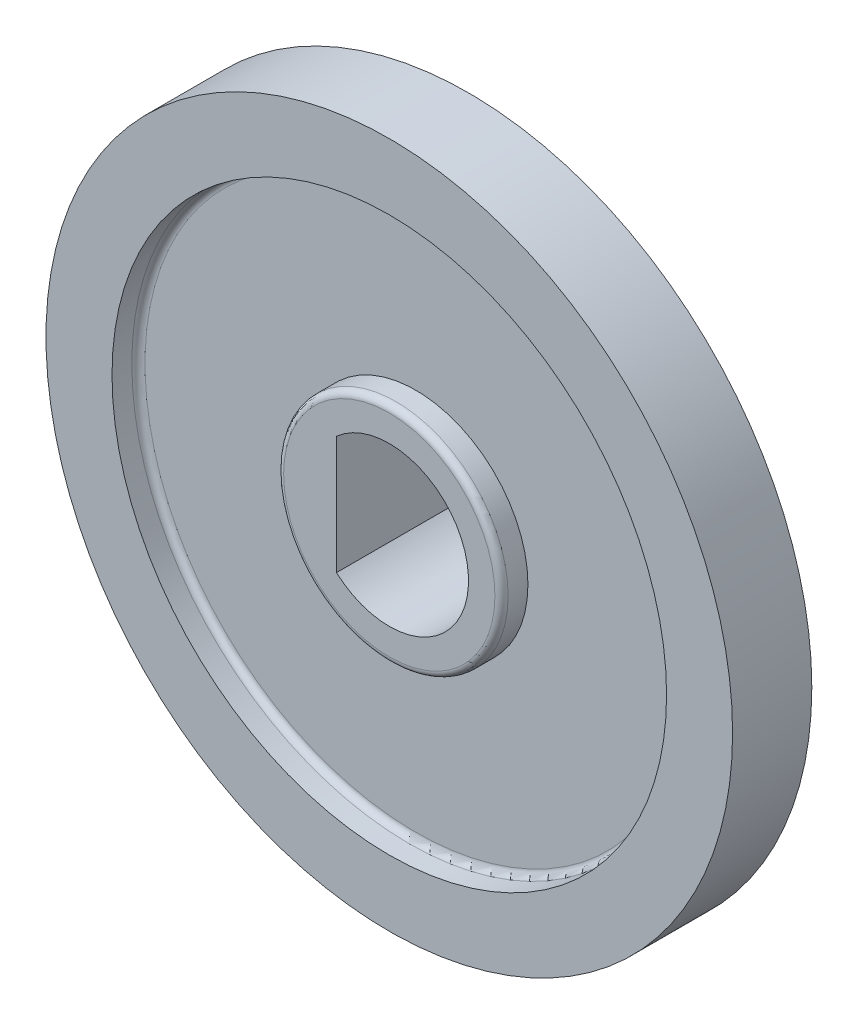
ISO-10303-21;
HEADER;
FILE_DESCRIPTION(('STEP AP214'),'2;1');
FILE_NAME('part.step','',(''),(''),'','','');
FILE_SCHEMA(('AUTOMOTIVE_DESIGN { 1 0 10303 214 1 1 1 1 }'));
ENDSEC;
DATA;
#1=APPLICATION_CONTEXT('core data for automotive mechanical design processes');
#2=APPLICATION_PROTOCOL_DEFINITION('international standard','automotive_design',2000,#1);
#3=PRODUCT_CONTEXT('',#1,'mechanical');
#4=PRODUCT('Part','Part','',(#3));
#5=PRODUCT_RELATED_PRODUCT_CATEGORY('part','',(#4));
#6=PRODUCT_DEFINITION_FORMATION('','',#4);
#7=PRODUCT_DEFINITION_CONTEXT('part definition',#1,'design');
#8=PRODUCT_DEFINITION('design','',#6,#7);
#9=PRODUCT_DEFINITION_SHAPE('','',#8);
#10=(LENGTH_UNIT() NAMED_UNIT(*) SI_UNIT(.MILLI.,.METRE.));
#11=(NAMED_UNIT(*) PLANE_ANGLE_UNIT() SI_UNIT($,.RADIAN.));
#12=(NAMED_UNIT(*) SI_UNIT($,.STERADIAN.) SOLID_ANGLE_UNIT());
#13=UNCERTAINTY_MEASURE_WITH_UNIT(LENGTH_MEASURE(1.E-05),#10,'distance_accuracy_value','');
#14=(GEOMETRIC_REPRESENTATION_CONTEXT(3) GLOBAL_UNCERTAINTY_ASSIGNED_CONTEXT((#13)) GLOBAL_UNIT_ASSIGNED_CONTEXT((#10,
#11,#12)) REPRESENTATION_CONTEXT('',''));
#15=CARTESIAN_POINT('',(0.,0.,0.));
#16=DIRECTION('',(0.,0.,1.));
#17=DIRECTION('',(1.,0.,0.));
#18=AXIS2_PLACEMENT_3D('',#15,#16,#17);
#19=CARTESIAN_POINT('',(12.4493620725286,0.168016430666877,0.));
#20=DIRECTION('',(0.,0.,-1.));
#21=DIRECTION('',(-1.,0.,0.));
#22=AXIS2_PLACEMENT_3D('',#19,#20,#21);
#23=PLANE('',#22);
#24=CARTESIAN_POINT('',(0.,1.80411241501588E-13,0.));
#25=DIRECTION('',(0.,0.,1.));
#26=DIRECTION('',(1.,0.,0.));
#27=AXIS2_PLACEMENT_3D('',#24,#25,#26);
#28=CIRCLE('',#27,13.);
#29=CARTESIAN_POINT('',(13.,1.80411241501588E-13,0.));
#30=VERTEX_POINT('',#29);
#31=EDGE_CURVE('E163',#30,#30,#28,.T.);
#32=ORIENTED_EDGE('',*,*,#31,.F.);
#33=EDGE_LOOP('',(#32));
#34=FACE_BOUND('',#33,.T.);
#35=CARTESIAN_POINT('',(1.83223184484201,7.80390816248508,0.));
#36=DIRECTION('',(0.,0.,-1.));
#37=DIRECTION('',(-1.,0.,0.));
#38=AXIS2_PLACEMENT_3D('',#35,#36,#37);
#39=CIRCLE('',#38,0.5);
#40=CARTESIAN_POINT('',(2.31519475798654,7.67449863993382,0.));
#41=VERTEX_POINT('',#40);
#42=CARTESIAN_POINT('',(1.71794752720512,7.31714426207516,0.));
#43=VERTEX_POINT('',#42);
#44=EDGE_CURVE('E211',#41,#43,#39,.T.);
#45=ORIENTED_EDGE('',*,*,#44,.F.);
#46=DIRECTION('',(-0.258819045102522,-0.96592582628907,0.));
#47=VECTOR('',#46,1.);
#48=CARTESIAN_POINT('',(1.11743469264317,3.20439722079534,0.));
#49=LINE('',#48,#47);
#50=CARTESIAN_POINT('',(2.69941085915804,9.10841265059187,0.));
#51=VERTEX_POINT('',#50);
#52=EDGE_CURVE('E228',#41,#51,#49,.F.);
#53=ORIENTED_EDGE('',*,*,#52,.T.);
#54=CARTESIAN_POINT('',(2.2164479460135,9.23782217314314,0.));
#55=DIRECTION('',(0.,0.,-1.));
#56=DIRECTION('',(-1.,0.,0.));
#57=AXIS2_PLACEMENT_3D('',#54,#55,#56);
#58=CIRCLE('',#57,0.5);
#59=CARTESIAN_POINT('',(2.33310310106685,9.72402334015066,0.));
#60=VERTEX_POINT('',#59);
#61=EDGE_CURVE('E226',#60,#51,#58,.T.);
#62=ORIENTED_EDGE('',*,*,#61,.F.);
#63=CARTESIAN_POINT('',(0.,0.,0.));
#64=DIRECTION('',(0.,0.,-1.));
#65=DIRECTION('',(-1.,0.,0.));
#66=AXIS2_PLACEMENT_3D('',#63,#64,#65);
#67=CIRCLE('',#66,10.0000000000001);
#68=CARTESIAN_POINT('',(-2.33310310106685,9.72402334015066,0.));
#69=VERTEX_POINT('',#68);
#70=EDGE_CURVE('E224',#60,#69,#67,.F.);
#71=ORIENTED_EDGE('',*,*,#70,.T.);
#72=CARTESIAN_POINT('',(-2.21644794601351,9.23782217314314,0.));
#73=DIRECTION('',(0.,0.,-1.));
#74=DIRECTION('',(-1.,0.,0.));
#75=AXIS2_PLACEMENT_3D('',#72,#73,#74);
#76=CIRCLE('',#75,0.5);
#77=CARTESIAN_POINT('',(-2.69941085915804,9.10841265059187,0.));
#78=VERTEX_POINT('',#77);
#79=EDGE_CURVE('E221',#78,#69,#76,.T.);
#80=ORIENTED_EDGE('',*,*,#79,.F.);
#81=DIRECTION('',(-0.258819045102522,0.96592582628907,0.));
#82=VECTOR('',#81,1.);
#83=CARTESIAN_POINT('',(0.550463564165188,-3.02028381546898,0.));
#84=LINE('',#83,#82);
#85=CARTESIAN_POINT('',(-2.31519475798654,7.67449863993382,0.));
#86=VERTEX_POINT('',#85);
#87=EDGE_CURVE('E219',#78,#86,#84,.F.);
#88=ORIENTED_EDGE('',*,*,#87,.T.);
#89=CARTESIAN_POINT('',(-1.83223184484201,7.80390816248508,0.));
#90=DIRECTION('',(0.,0.,-1.));
#91=DIRECTION('',(-1.,0.,0.));
#92=AXIS2_PLACEMENT_3D('',#89,#90,#91);
#93=CIRCLE('',#92,0.5);
#94=CARTESIAN_POINT('',(-1.71794752720512,7.31714426207517,0.));
#95=VERTEX_POINT('',#94);
#96=EDGE_CURVE('E216',#95,#86,#93,.T.);
#97=ORIENTED_EDGE('',*,*,#96,.F.);
#98=CARTESIAN_POINT('',(0.,0.,0.));
#99=DIRECTION('',(0.,0.,-1.));
#100=DIRECTION('',(-1.,0.,0.));
#101=AXIS2_PLACEMENT_3D('',#98,#99,#100);
#102=CIRCLE('',#101,7.51611228350465);
#103=EDGE_CURVE('E214',#95,#43,#102,.T.);
#104=ORIENTED_EDGE('',*,*,#103,.T.);
#105=EDGE_LOOP('',(#45,#53,#62,#71,#80,#88,#97,#104));
#106=FACE_BOUND('',#105,.T.);
#107=CARTESIAN_POINT('',(0.,1.80411241501588E-13,0.));
#108=DIRECTION('',(0.,0.,-1.));
#109=DIRECTION('',(-1.,0.,0.));
#110=AXIS2_PLACEMENT_3D('',#107,#108,#109);
#111=CIRCLE('',#110,4.24999999999994);
#112=CARTESIAN_POINT('',(-4.24999999999996,1.80411241501588E-13,0.));
#113=VERTEX_POINT('',#112);
#114=EDGE_CURVE('E169',#113,#113,#111,.T.);
#115=ORIENTED_EDGE('',*,*,#114,.F.);
#116=EDGE_LOOP('',(#115));
#117=FACE_BOUND('',#116,.T.);
#118=ADVANCED_FACE('F37',(#34,#106,#117),#23,.T.);
#119=CARTESIAN_POINT('',(12.4493620725286,0.168016430666877,3.));
#120=DIRECTION('',(0.,0.,-1.));
#121=DIRECTION('',(-1.,0.,0.));
#122=AXIS2_PLACEMENT_3D('',#119,#120,#121);
#123=PLANE('',#122);
#124=CARTESIAN_POINT('',(0.,0.,3.));
#125=DIRECTION('',(0.,0.,-1.));
#126=DIRECTION('',(-1.,0.,0.));
#127=AXIS2_PLACEMENT_3D('',#124,#125,#126);
#128=CIRCLE('',#127,4.);
#129=CARTESIAN_POINT('',(-4.00000000000001,0.,3.));
#130=VERTEX_POINT('',#129);
#131=EDGE_CURVE('E46',#130,#130,#128,.F.);
#132=ORIENTED_EDGE('',*,*,#131,.T.);
#133=EDGE_LOOP('',(#132));
#134=FACE_BOUND('',#133,.T.);
#135=CARTESIAN_POINT('',(0.,1.80411241501588E-13,3.));
#136=DIRECTION('',(0.,0.,1.));
#137=DIRECTION('',(1.,0.,0.));
#138=AXIS2_PLACEMENT_3D('',#135,#136,#137);
#139=CIRCLE('',#138,3.);
#140=CARTESIAN_POINT('',(-2.00000000000001,-2.23606797749962,3.));
#141=VERTEX_POINT('',#140);
#142=CARTESIAN_POINT('',(-2.00000000000002,2.23606797749996,3.));
#143=VERTEX_POINT('',#142);
#144=EDGE_CURVE('E160',#141,#143,#139,.T.);
#145=ORIENTED_EDGE('',*,*,#144,.F.);
#146=DIRECTION('',(0.,-1.,0.));
#147=VECTOR('',#146,1.);
#148=CARTESIAN_POINT('',(-2.00000000000002,2.23606797749996,3.));
#149=LINE('',#148,#147);
#150=EDGE_CURVE('E185',#143,#141,#149,.T.);
#151=ORIENTED_EDGE('',*,*,#150,.F.);
#152=EDGE_LOOP('',(#145,#151));
#153=FACE_BOUND('',#152,.T.);
#154=ADVANCED_FACE('F392',(#134,#153),#123,.F.);
#155=CARTESIAN_POINT('',(0.,1.80411241501588E-13,3.));
#156=DIRECTION('',(0.,0.,1.));
#157=DIRECTION('',(1.,0.,0.));
#158=AXIS2_PLACEMENT_3D('',#155,#156,#157);
#159=CIRCLE('',#158,13.);
#160=CARTESIAN_POINT('',(13.,1.80411241501588E-13,3.));
#161=VERTEX_POINT('',#160);
#162=EDGE_CURVE('E188',#161,#161,#159,.T.);
#163=ORIENTED_EDGE('',*,*,#162,.T.);
#164=EDGE_LOOP('',(#163));
#165=FACE_BOUND('',#164,.T.);
#166=CARTESIAN_POINT('',(0.,0.,3.));
#167=DIRECTION('',(0.,0.,1.));
#168=DIRECTION('',(1.,0.,0.));
#169=AXIS2_PLACEMENT_3D('',#166,#167,#168);
#170=CIRCLE('',#169,10.5);
#171=CARTESIAN_POINT('',(10.5,0.,3.));
#172=VERTEX_POINT('',#171);
#173=EDGE_CURVE('E181',#172,#172,#170,.T.);
#174=ORIENTED_EDGE('',*,*,#173,.F.);
#175=EDGE_LOOP('',(#174));
#176=FACE_BOUND('',#175,.T.);
#177=ADVANCED_FACE('F398',(#165,#176),#123,.F.);
#178=CARTESIAN_POINT('',(0.,1.80411241501588E-13,3.));
#179=DIRECTION('',(0.,0.,-1.));
#180=DIRECTION('',(-1.,0.,0.));
#181=AXIS2_PLACEMENT_3D('',#178,#179,#180);
#182=CYLINDRICAL_SURFACE('',#181,13.);
#183=ORIENTED_EDGE('',*,*,#31,.T.);
#184=EDGE_LOOP('',(#183));
#185=FACE_BOUND('',#184,.T.);
#186=ORIENTED_EDGE('',*,*,#162,.F.);
#187=EDGE_LOOP('',(#186));
#188=FACE_BOUND('',#187,.T.);
#189=ADVANCED_FACE('F405',(#185,#188),#182,.T.);
#190=CARTESIAN_POINT('',(0.,1.80411241501588E-13,3.));
#191=DIRECTION('',(0.,0.,-1.));
#192=DIRECTION('',(-1.,0.,0.));
#193=AXIS2_PLACEMENT_3D('',#190,#191,#192);
#194=CYLINDRICAL_SURFACE('',#193,3.);
#195=DIRECTION('',(0.,0.,-1.));
#196=VECTOR('',#195,1.);
#197=CARTESIAN_POINT('',(-2.00000000000002,2.23606797749996,3.));
#198=LINE('',#197,#196);
#199=CARTESIAN_POINT('',(-2.00000000000002,2.23606797749996,-3.3));
#200=VERTEX_POINT('',#199);
#201=EDGE_CURVE('E152',#143,#200,#198,.T.);
#202=ORIENTED_EDGE('',*,*,#201,.T.);
#203=CARTESIAN_POINT('',(0.,1.73472347597681E-13,-3.3));
#204=DIRECTION('',(0.,0.,-1.));
#205=DIRECTION('',(-1.,0.,0.));
#206=AXIS2_PLACEMENT_3D('',#203,#204,#205);
#207=CIRCLE('',#206,3.);
#208=CARTESIAN_POINT('',(-2.00000000000002,-2.23606797749962,-3.3));
#209=VERTEX_POINT('',#208);
#210=EDGE_CURVE('E157',#200,#209,#207,.T.);
#211=ORIENTED_EDGE('',*,*,#210,.T.);
#212=DIRECTION('',(0.,0.,-1.));
#213=VECTOR('',#212,1.);
#214=CARTESIAN_POINT('',(-2.00000000000001,-2.23606797749962,3.));
#215=LINE('',#214,#213);
#216=EDGE_CURVE('E164',#141,#209,#215,.T.);
#217=ORIENTED_EDGE('',*,*,#216,.F.);
#218=ORIENTED_EDGE('',*,*,#144,.T.);
#219=EDGE_LOOP('',(#202,#211,#217,#218));
#220=FACE_BOUND('',#219,.T.);
#221=ADVANCED_FACE('F154',(#220),#194,.F.);
#222=CARTESIAN_POINT('',(-2.00000000000002,2.23606797749996,3.));
#223=DIRECTION('',(1.,0.,0.));
#224=DIRECTION('',(0.,1.,0.));
#225=AXIS2_PLACEMENT_3D('',#222,#223,#224);
#226=PLANE('',#225);
#227=ORIENTED_EDGE('',*,*,#216,.T.);
#228=DIRECTION('',(0.,1.,0.));
#229=VECTOR('',#228,1.);
#230=CARTESIAN_POINT('',(-2.00000000000002,2.23606797749996,-3.3));
#231=LINE('',#230,#229);
#232=EDGE_CURVE('E166',#209,#200,#231,.T.);
#233=ORIENTED_EDGE('',*,*,#232,.T.);
#234=ORIENTED_EDGE('',*,*,#201,.F.);
#235=ORIENTED_EDGE('',*,*,#150,.T.);
#236=EDGE_LOOP('',(#227,#233,#234,#235));
#237=FACE_BOUND('',#236,.T.);
#238=ADVANCED_FACE('F167',(#237),#226,.T.);
#239=CARTESIAN_POINT('',(0.,0.,2.));
#240=DIRECTION('',(0.,0.,1.));
#241=DIRECTION('',(1.,0.,0.));
#242=AXIS2_PLACEMENT_3D('',#239,#240,#241);
#243=CYLINDRICAL_SURFACE('',#242,10.5);
#244=CARTESIAN_POINT('',(0.,0.,2.25));
#245=DIRECTION('',(0.,0.,1.));
#246=DIRECTION('',(1.,0.,0.));
#247=AXIS2_PLACEMENT_3D('',#244,#245,#246);
#248=CIRCLE('',#247,10.5);
#249=CARTESIAN_POINT('',(10.5,0.,2.25));
#250=VERTEX_POINT('',#249);
#251=EDGE_CURVE('E258',#250,#250,#248,.F.);
#252=ORIENTED_EDGE('',*,*,#251,.T.);
#253=EDGE_LOOP('',(#252));
#254=FACE_BOUND('',#253,.T.);
#255=ORIENTED_EDGE('',*,*,#173,.T.);
#256=EDGE_LOOP('',(#255));
#257=FACE_BOUND('',#256,.T.);
#258=ADVANCED_FACE('F499',(#254,#257),#243,.F.);
#259=CARTESIAN_POINT('',(0.,0.,2.));
#260=DIRECTION('',(0.,0.,1.));
#261=DIRECTION('',(1.,0.,0.));
#262=AXIS2_PLACEMENT_3D('',#259,#260,#261);
#263=PLANE('',#262);
#264=CARTESIAN_POINT('',(0.,0.,2.));
#265=DIRECTION('',(0.,0.,1.));
#266=DIRECTION('',(1.,0.,0.));
#267=AXIS2_PLACEMENT_3D('',#264,#265,#266);
#268=CIRCLE('',#267,10.25);
#269=CARTESIAN_POINT('',(10.25,0.,2.));
#270=VERTEX_POINT('',#269);
#271=EDGE_CURVE('E255',#270,#270,#268,.T.);
#272=ORIENTED_EDGE('',*,*,#271,.T.);
#273=EDGE_LOOP('',(#272));
#274=FACE_BOUND('',#273,.T.);
#275=CARTESIAN_POINT('',(0.,0.,2.));
#276=DIRECTION('',(0.,0.,1.));
#277=DIRECTION('',(1.,0.,0.));
#278=AXIS2_PLACEMENT_3D('',#275,#276,#277);
#279=CIRCLE('',#278,4.25);
#280=CARTESIAN_POINT('',(4.25000000000001,0.,2.));
#281=VERTEX_POINT('',#280);
#282=EDGE_CURVE('E178',#281,#281,#279,.T.);
#283=ORIENTED_EDGE('',*,*,#282,.F.);
#284=EDGE_LOOP('',(#283));
#285=FACE_BOUND('',#284,.T.);
#286=ADVANCED_FACE('F492',(#274,#285),#263,.T.);
#287=CARTESIAN_POINT('',(0.,0.,2.));
#288=DIRECTION('',(0.,0.,1.));
#289=DIRECTION('',(1.,0.,0.));
#290=AXIS2_PLACEMENT_3D('',#287,#288,#289);
#291=CYLINDRICAL_SURFACE('',#290,4.25);
#292=CARTESIAN_POINT('',(0.,0.,2.75));
#293=DIRECTION('',(0.,0.,-1.));
#294=DIRECTION('',(-1.,0.,0.));
#295=AXIS2_PLACEMENT_3D('',#292,#293,#294);
#296=CIRCLE('',#295,4.25);
#297=CARTESIAN_POINT('',(-4.25000000000001,0.,2.75));
#298=VERTEX_POINT('',#297);
#299=EDGE_CURVE('E11',#298,#298,#296,.T.);
#300=ORIENTED_EDGE('',*,*,#299,.T.);
#301=EDGE_LOOP('',(#300));
#302=FACE_BOUND('',#301,.T.);
#303=ORIENTED_EDGE('',*,*,#282,.T.);
#304=EDGE_LOOP('',(#303));
#305=FACE_BOUND('',#304,.T.);
#306=ADVANCED_FACE('F484',(#302,#305),#291,.T.);
#307=CARTESIAN_POINT('',(0.,1.73472347597681E-13,-3.3));
#308=DIRECTION('',(0.,0.,-1.));
#309=DIRECTION('',(-1.,0.,0.));
#310=AXIS2_PLACEMENT_3D('',#307,#308,#309);
#311=PLANE('',#310);
#312=CARTESIAN_POINT('',(0.,1.73472347597681E-13,-3.3));
#313=DIRECTION('',(0.,0.,-1.));
#314=DIRECTION('',(-1.,0.,0.));
#315=AXIS2_PLACEMENT_3D('',#312,#313,#314);
#316=CIRCLE('',#315,3.99999999999994);
#317=CARTESIAN_POINT('',(-3.99999999999996,1.73472347597681E-13,-3.3));
#318=VERTEX_POINT('',#317);
#319=EDGE_CURVE('E261',#318,#318,#316,.T.);
#320=ORIENTED_EDGE('',*,*,#319,.T.);
#321=EDGE_LOOP('',(#320));
#322=FACE_BOUND('',#321,.T.);
#323=ORIENTED_EDGE('',*,*,#232,.F.);
#324=ORIENTED_EDGE('',*,*,#210,.F.);
#325=EDGE_LOOP('',(#323,#324));
#326=FACE_BOUND('',#325,.T.);
#327=ADVANCED_FACE('F171',(#322,#326),#311,.T.);
#328=CARTESIAN_POINT('',(0.,1.73472347597681E-13,-3.3));
#329=DIRECTION('',(0.,0.,1.));
#330=DIRECTION('',(1.,0.,0.));
#331=AXIS2_PLACEMENT_3D('',#328,#329,#330);
#332=CYLINDRICAL_SURFACE('',#331,4.24999999999994);
#333=CARTESIAN_POINT('',(0.,1.73472347597681E-13,-3.05));
#334=DIRECTION('',(0.,0.,-1.));
#335=DIRECTION('',(-1.,0.,0.));
#336=AXIS2_PLACEMENT_3D('',#333,#334,#335);
#337=CIRCLE('',#336,4.24999999999994);
#338=CARTESIAN_POINT('',(-4.24999999999996,1.73472347597681E-13,-3.05));
#339=VERTEX_POINT('',#338);
#340=EDGE_CURVE('E264',#339,#339,#337,.F.);
#341=ORIENTED_EDGE('',*,*,#340,.T.);
#342=EDGE_LOOP('',(#341));
#343=FACE_BOUND('',#342,.T.);
#344=ORIENTED_EDGE('',*,*,#114,.T.);
#345=EDGE_LOOP('',(#344));
#346=FACE_BOUND('',#345,.T.);
#347=ADVANCED_FACE('F483',(#343,#346),#332,.T.);
#348=CARTESIAN_POINT('',(0.,0.,-1.75));
#349=DIRECTION('',(0.,0.,1.));
#350=DIRECTION('',(1.,0.,0.));
#351=AXIS2_PLACEMENT_3D('',#348,#349,#350);
#352=CYLINDRICAL_SURFACE('',#351,9.75000000000012);
#353=DIRECTION('',(0.,0.,1.));
#354=VECTOR('',#353,1.);
#355=CARTESIAN_POINT('',(2.27477552354017,9.4809227566469,-1.75));
#356=LINE('',#355,#354);
#357=CARTESIAN_POINT('',(2.27477552354017,9.4809227566469,-0.25));
#358=VERTEX_POINT('',#357);
#359=CARTESIAN_POINT('',(2.27477552354017,9.4809227566469,-1.5));
#360=VERTEX_POINT('',#359);
#361=EDGE_CURVE('E235',#358,#360,#356,.F.);
#362=ORIENTED_EDGE('',*,*,#361,.T.);
#363=CARTESIAN_POINT('',(0.,0.,-1.5));
#364=DIRECTION('',(0.,0.,-1.));
#365=DIRECTION('',(-1.,0.,0.));
#366=AXIS2_PLACEMENT_3D('',#363,#364,#365);
#367=CIRCLE('',#366,9.75000000000012);
#368=CARTESIAN_POINT('',(-2.27477552354018,9.4809227566469,-1.5));
#369=VERTEX_POINT('',#368);
#370=EDGE_CURVE('E237',#360,#369,#367,.F.);
#371=ORIENTED_EDGE('',*,*,#370,.T.);
#372=DIRECTION('',(0.,0.,1.));
#373=VECTOR('',#372,1.);
#374=CARTESIAN_POINT('',(-2.27477552354018,9.4809227566469,-1.75));
#375=LINE('',#374,#373);
#376=CARTESIAN_POINT('',(-2.27477552354018,9.4809227566469,-0.25));
#377=VERTEX_POINT('',#376);
#378=EDGE_CURVE('E231',#369,#377,#375,.T.);
#379=ORIENTED_EDGE('',*,*,#378,.T.);
#380=CARTESIAN_POINT('',(0.,0.,-0.25));
#381=DIRECTION('',(0.,0.,-1.));
#382=DIRECTION('',(-1.,0.,0.));
#383=AXIS2_PLACEMENT_3D('',#380,#381,#382);
#384=CIRCLE('',#383,9.75000000000012);
#385=EDGE_CURVE('E233',#377,#358,#384,.T.);
#386=ORIENTED_EDGE('',*,*,#385,.T.);
#387=EDGE_LOOP('',(#362,#371,#379,#386));
#388=FACE_BOUND('',#387,.T.);
#389=ADVANCED_FACE('F389',(#388),#352,.T.);
#390=CARTESIAN_POINT('',(2.01001776537564,7.50148842449792,-1.75));
#391=DIRECTION('',(-0.96592582628907,0.258819045102522,0.));
#392=DIRECTION('',(-0.258819045102522,-0.96592582628907,0.));
#393=AXIS2_PLACEMENT_3D('',#390,#391,#392);
#394=PLANE('',#393);
#395=DIRECTION('',(-0.258819045102522,-0.96592582628907,0.));
#396=VECTOR('',#395,1.);
#397=CARTESIAN_POINT('',(2.52348568974961,9.41777680631854,-1.5));
#398=LINE('',#397,#396);
#399=CARTESIAN_POINT('',(2.07371330141427,7.73920340120945,-1.5));
#400=VERTEX_POINT('',#399);
#401=CARTESIAN_POINT('',(2.45792940258577,9.17311741186751,-1.5));
#402=VERTEX_POINT('',#401);
#403=EDGE_CURVE('E206',#400,#402,#398,.F.);
#404=ORIENTED_EDGE('',*,*,#403,.T.);
#405=DIRECTION('',(0.,0.,1.));
#406=VECTOR('',#405,1.);
#407=CARTESIAN_POINT('',(2.45792940258577,9.17311741186751,-1.75));
#408=LINE('',#407,#406);
#409=CARTESIAN_POINT('',(2.45792940258577,9.17311741186751,-0.25));
#410=VERTEX_POINT('',#409);
#411=EDGE_CURVE('E209',#402,#410,#408,.T.);
#412=ORIENTED_EDGE('',*,*,#411,.T.);
#413=DIRECTION('',(-0.258819045102522,-0.96592582628907,0.));
#414=VECTOR('',#413,1.);
#415=CARTESIAN_POINT('',(2.01001776537564,7.50148842449792,-0.25));
#416=LINE('',#415,#414);
#417=CARTESIAN_POINT('',(2.07371330141427,7.73920340120945,-0.25));
#418=VERTEX_POINT('',#417);
#419=EDGE_CURVE('E204',#410,#418,#416,.T.);
#420=ORIENTED_EDGE('',*,*,#419,.T.);
#421=DIRECTION('',(0.,0.,1.));
#422=VECTOR('',#421,1.);
#423=CARTESIAN_POINT('',(2.07371330141427,7.73920340120945,-1.75));
#424=LINE('',#423,#422);
#425=EDGE_CURVE('E202',#418,#400,#424,.F.);
#426=ORIENTED_EDGE('',*,*,#425,.T.);
#427=EDGE_LOOP('',(#404,#412,#420,#426));
#428=FACE_BOUND('',#427,.T.);
#429=ADVANCED_FACE('F362',(#428),#394,.F.);
#430=CARTESIAN_POINT('',(0.,0.,-1.75));
#431=DIRECTION('',(0.,0.,1.));
#432=DIRECTION('',(1.,0.,0.));
#433=AXIS2_PLACEMENT_3D('',#430,#431,#432);
#434=CYLINDRICAL_SURFACE('',#433,7.76611228350465);
#435=CARTESIAN_POINT('',(0.,0.,-1.5));
#436=DIRECTION('',(0.,0.,-1.));
#437=DIRECTION('',(-1.,0.,0.));
#438=AXIS2_PLACEMENT_3D('',#435,#436,#437);
#439=CIRCLE('',#438,7.76611228350465);
#440=CARTESIAN_POINT('',(-1.77508968602357,7.56052621228012,-1.5));
#441=VERTEX_POINT('',#440);
#442=CARTESIAN_POINT('',(1.77508968602356,7.56052621228012,-1.5));
#443=VERTEX_POINT('',#442);
#444=EDGE_CURVE('E54',#441,#443,#439,.T.);
#445=ORIENTED_EDGE('',*,*,#444,.T.);
#446=DIRECTION('',(0.,0.,1.));
#447=VECTOR('',#446,1.);
#448=CARTESIAN_POINT('',(1.77508968602356,7.56052621228012,-1.75));
#449=LINE('',#448,#447);
#450=CARTESIAN_POINT('',(1.77508968602356,7.56052621228012,-0.25));
#451=VERTEX_POINT('',#450);
#452=EDGE_CURVE('E253',#443,#451,#449,.T.);
#453=ORIENTED_EDGE('',*,*,#452,.T.);
#454=CARTESIAN_POINT('',(0.,0.,-0.25));
#455=DIRECTION('',(0.,0.,-1.));
#456=DIRECTION('',(-1.,0.,0.));
#457=AXIS2_PLACEMENT_3D('',#454,#455,#456);
#458=CIRCLE('',#457,7.76611228350465);
#459=CARTESIAN_POINT('',(-1.77508968602357,7.56052621228012,-0.25));
#460=VERTEX_POINT('',#459);
#461=EDGE_CURVE('E249',#451,#460,#458,.F.);
#462=ORIENTED_EDGE('',*,*,#461,.T.);
#463=DIRECTION('',(0.,0.,1.));
#464=VECTOR('',#463,1.);
#465=CARTESIAN_POINT('',(-1.77508968602357,7.56052621228013,-1.75));
#466=LINE('',#465,#464);
#467=EDGE_CURVE('E59',#460,#441,#466,.F.);
#468=ORIENTED_EDGE('',*,*,#467,.T.);
#469=EDGE_LOOP('',(#445,#453,#462,#468));
#470=FACE_BOUND('',#469,.T.);
#471=ADVANCED_FACE('F378',(#470),#434,.F.);
#472=CARTESIAN_POINT('',(-2.01001776537564,7.50148842449793,-1.75));
#473=DIRECTION('',(0.96592582628907,0.258819045102522,0.));
#474=DIRECTION('',(-0.258819045102522,0.96592582628907,0.));
#475=AXIS2_PLACEMENT_3D('',#472,#473,#474);
#476=PLANE('',#475);
#477=DIRECTION('',(0.,0.,1.));
#478=VECTOR('',#477,1.);
#479=CARTESIAN_POINT('',(-2.45792940258578,9.17311741186751,-1.75));
#480=LINE('',#479,#478);
#481=CARTESIAN_POINT('',(-2.45792940258578,9.17311741186751,-0.25));
#482=VERTEX_POINT('',#481);
#483=CARTESIAN_POINT('',(-2.45792940258578,9.17311741186751,-1.5));
#484=VERTEX_POINT('',#483);
#485=EDGE_CURVE('E244',#482,#484,#480,.F.);
#486=ORIENTED_EDGE('',*,*,#485,.T.);
#487=DIRECTION('',(-0.258819045102522,0.96592582628907,0.));
#488=VECTOR('',#487,1.);
#489=CARTESIAN_POINT('',(-2.01001776537564,7.50148842449793,-1.5));
#490=LINE('',#489,#488);
#491=CARTESIAN_POINT('',(-2.07371330141428,7.73920340120945,-1.5));
#492=VERTEX_POINT('',#491);
#493=EDGE_CURVE('E246',#484,#492,#490,.F.);
#494=ORIENTED_EDGE('',*,*,#493,.T.);
#495=DIRECTION('',(0.,0.,1.));
#496=VECTOR('',#495,1.);
#497=CARTESIAN_POINT('',(-2.07371330141428,7.73920340120945,-1.75));
#498=LINE('',#497,#496);
#499=CARTESIAN_POINT('',(-2.07371330141428,7.73920340120945,-0.25));
#500=VERTEX_POINT('',#499);
#501=EDGE_CURVE('E240',#492,#500,#498,.T.);
#502=ORIENTED_EDGE('',*,*,#501,.T.);
#503=DIRECTION('',(-0.258819045102522,0.96592582628907,0.));
#504=VECTOR('',#503,1.);
#505=CARTESIAN_POINT('',(-2.01001776537564,7.50148842449793,-0.25));
#506=LINE('',#505,#504);
#507=EDGE_CURVE('E242',#500,#482,#506,.T.);
#508=ORIENTED_EDGE('',*,*,#507,.T.);
#509=EDGE_LOOP('',(#486,#494,#502,#508));
#510=FACE_BOUND('',#509,.T.);
#511=ADVANCED_FACE('F380',(#510),#476,.F.);
#512=CARTESIAN_POINT('',(0.,0.,-1.75));
#513=DIRECTION('',(0.,0.,-1.));
#514=DIRECTION('',(-1.,0.,0.));
#515=AXIS2_PLACEMENT_3D('',#512,#513,#514);
#516=PLANE('',#515);
#517=CARTESIAN_POINT('',(0.,0.,-1.75));
#518=DIRECTION('',(0.,0.,-1.));
#519=DIRECTION('',(-1.,0.,0.));
#520=AXIS2_PLACEMENT_3D('',#517,#518,#519);
#521=CIRCLE('',#520,9.50000000000012);
#522=CARTESIAN_POINT('',(-2.21644794601351,9.23782217314314,-1.75));
#523=VERTEX_POINT('',#522);
#524=CARTESIAN_POINT('',(2.2164479460135,9.23782217314314,-1.75));
#525=VERTEX_POINT('',#524);
#526=EDGE_CURVE('E197',#523,#525,#521,.T.);
#527=ORIENTED_EDGE('',*,*,#526,.T.);
#528=DIRECTION('',(-0.258819045102522,-0.96592582628907,0.));
#529=VECTOR('',#528,1.);
#530=CARTESIAN_POINT('',(1.76853630880337,7.56619318577355,-1.75));
#531=LINE('',#530,#529);
#532=CARTESIAN_POINT('',(1.83223184484201,7.80390816248507,-1.75));
#533=VERTEX_POINT('',#532);
#534=EDGE_CURVE('E199',#525,#533,#531,.T.);
#535=ORIENTED_EDGE('',*,*,#534,.T.);
#536=CARTESIAN_POINT('',(0.,0.,-1.75));
#537=DIRECTION('',(0.,0.,-1.));
#538=DIRECTION('',(-1.,0.,0.));
#539=AXIS2_PLACEMENT_3D('',#536,#537,#538);
#540=CIRCLE('',#539,8.01611228350465);
#541=CARTESIAN_POINT('',(-1.83223184484201,7.80390816248508,-1.75));
#542=VERTEX_POINT('',#541);
#543=EDGE_CURVE('E191',#533,#542,#540,.F.);
#544=ORIENTED_EDGE('',*,*,#543,.T.);
#545=DIRECTION('',(-0.258819045102522,0.96592582628907,0.));
#546=VECTOR('',#545,1.);
#547=CARTESIAN_POINT('',(-2.28200423317735,9.48248156759417,-1.75));
#548=LINE('',#547,#546);
#549=EDGE_CURVE('E195',#542,#523,#548,.T.);
#550=ORIENTED_EDGE('',*,*,#549,.T.);
#551=EDGE_LOOP('',(#527,#535,#544,#550));
#552=FACE_BOUND('',#551,.T.);
#553=ADVANCED_FACE('F386',(#552),#516,.T.);
#554=CARTESIAN_POINT('',(-2.25149922194791,7.43678366322229,-0.25));
#555=DIRECTION('',(-0.258819045102522,0.96592582628907,0.));
#556=DIRECTION('',(-0.96592582628907,-0.258819045102522,0.));
#557=AXIS2_PLACEMENT_3D('',#554,#555,#556);
#558=CYLINDRICAL_SURFACE('',#557,0.25);
#559=CARTESIAN_POINT('',(-2.31519475798654,7.67449863993382,-0.25));
#560=DIRECTION('',(-0.258819045102524,0.96592582628907,0.));
#561=DIRECTION('',(-0.96592582628907,-0.258819045102524,0.));
#562=AXIS2_PLACEMENT_3D('',#559,#560,#561);
#563=CIRCLE('',#562,0.25);
#564=EDGE_CURVE('E174',#86,#500,#563,.T.);
#565=ORIENTED_EDGE('',*,*,#564,.F.);
#566=ORIENTED_EDGE('',*,*,#87,.F.);
#567=CARTESIAN_POINT('',(-2.69941085915804,9.10841265059187,-0.25));
#568=DIRECTION('',(0.25881904510252,-0.965925826289071,0.));
#569=DIRECTION('',(0.965925826289071,0.25881904510252,0.));
#570=AXIS2_PLACEMENT_3D('',#567,#568,#569);
#571=CIRCLE('',#570,0.25);
#572=EDGE_CURVE('E41',#482,#78,#571,.T.);
#573=ORIENTED_EDGE('',*,*,#572,.F.);
#574=ORIENTED_EDGE('',*,*,#507,.F.);
#575=EDGE_LOOP('',(#565,#566,#573,#574));
#576=FACE_BOUND('',#575,.T.);
#577=ADVANCED_FACE('F465',(#576),#558,.F.);
#578=CARTESIAN_POINT('',(-2.21644794601351,9.23782217314314,-0.25));
#579=DIRECTION('',(0.,0.,-1.));
#580=DIRECTION('',(-1.,0.,0.));
#581=AXIS2_PLACEMENT_3D('',#578,#579,#580);
#582=TOROIDAL_SURFACE('',#581,0.5,0.25);
#583=ORIENTED_EDGE('',*,*,#572,.T.);
#584=ORIENTED_EDGE('',*,*,#79,.T.);
#585=CARTESIAN_POINT('',(-2.33310310106685,9.72402334015066,-0.25));
#586=DIRECTION('',(0.972402334015056,0.233310310106682,0.));
#587=DIRECTION('',(-0.233310310106682,0.972402334015056,0.));
#588=AXIS2_PLACEMENT_3D('',#585,#586,#587);
#589=CIRCLE('',#588,0.25);
#590=EDGE_CURVE('E327',#377,#69,#589,.F.);
#591=ORIENTED_EDGE('',*,*,#590,.F.);
#592=CARTESIAN_POINT('',(-2.21644794601351,9.23782217314314,-0.25));
#593=DIRECTION('',(0.,0.,-1.));
#594=DIRECTION('',(-1.,0.,0.));
#595=AXIS2_PLACEMENT_3D('',#592,#593,#594);
#596=CIRCLE('',#595,0.25);
#597=EDGE_CURVE('E324',#482,#377,#596,.T.);
#598=ORIENTED_EDGE('',*,*,#597,.F.);
#599=EDGE_LOOP('',(#583,#584,#591,#598));
#600=FACE_BOUND('',#599,.T.);
#601=ADVANCED_FACE('F462',(#600),#582,.F.);
#602=CARTESIAN_POINT('',(-1.83223184484201,7.80390816248508,-0.25));
#603=DIRECTION('',(0.,0.,-1.));
#604=DIRECTION('',(-1.,0.,0.));
#605=AXIS2_PLACEMENT_3D('',#602,#603,#604);
#606=TOROIDAL_SURFACE('',#605,0.5,0.25);
#607=ORIENTED_EDGE('',*,*,#96,.T.);
#608=ORIENTED_EDGE('',*,*,#564,.T.);
#609=CARTESIAN_POINT('',(-1.83223184484201,7.80390816248508,-0.25));
#610=DIRECTION('',(0.,0.,-1.));
#611=DIRECTION('',(-1.,0.,0.));
#612=AXIS2_PLACEMENT_3D('',#609,#610,#611);
#613=CIRCLE('',#612,0.25);
#614=EDGE_CURVE('E321',#460,#500,#613,.T.);
#615=ORIENTED_EDGE('',*,*,#614,.F.);
#616=CARTESIAN_POINT('',(-1.71794752720512,7.31714426207517,-0.25));
#617=DIRECTION('',(0.973527800819827,0.228568635273776,0.));
#618=DIRECTION('',(-0.228568635273776,0.973527800819827,0.));
#619=AXIS2_PLACEMENT_3D('',#616,#617,#618);
#620=CIRCLE('',#619,0.25);
#621=EDGE_CURVE('E318',#95,#460,#620,.F.);
#622=ORIENTED_EDGE('',*,*,#621,.F.);
#623=EDGE_LOOP('',(#607,#608,#615,#622));
#624=FACE_BOUND('',#623,.T.);
#625=ADVANCED_FACE('F333',(#624),#606,.F.);
#626=CARTESIAN_POINT('',(0.,0.,-0.25));
#627=DIRECTION('',(0.,0.,-1.));
#628=DIRECTION('',(-1.,0.,0.));
#629=AXIS2_PLACEMENT_3D('',#626,#627,#628);
#630=TOROIDAL_SURFACE('',#629,10.0000000000001,0.25);
#631=ORIENTED_EDGE('',*,*,#590,.T.);
#632=ORIENTED_EDGE('',*,*,#70,.F.);
#633=CARTESIAN_POINT('',(2.33310310106685,9.72402334015066,-0.25));
#634=DIRECTION('',(-0.972402334015056,0.233310310106682,0.));
#635=DIRECTION('',(-0.233310310106682,-0.972402334015056,0.));
#636=AXIS2_PLACEMENT_3D('',#633,#634,#635);
#637=CIRCLE('',#636,0.25);
#638=EDGE_CURVE('E312',#358,#60,#637,.T.);
#639=ORIENTED_EDGE('',*,*,#638,.F.);
#640=ORIENTED_EDGE('',*,*,#385,.F.);
#641=EDGE_LOOP('',(#631,#632,#639,#640));
#642=FACE_BOUND('',#641,.T.);
#643=ADVANCED_FACE('F455',(#642),#630,.F.);
#644=CARTESIAN_POINT('',(-2.21644794601351,9.23782217314314,-1.75));
#645=DIRECTION('',(0.,0.,1.));
#646=DIRECTION('',(1.,0.,0.));
#647=AXIS2_PLACEMENT_3D('',#644,#645,#646);
#648=CYLINDRICAL_SURFACE('',#647,0.25);
#649=ORIENTED_EDGE('',*,*,#597,.T.);
#650=ORIENTED_EDGE('',*,*,#378,.F.);
#651=CARTESIAN_POINT('',(-2.21644794601351,9.23782217314314,-1.5));
#652=DIRECTION('',(0.,0.,-1.));
#653=DIRECTION('',(-1.,0.,0.));
#654=AXIS2_PLACEMENT_3D('',#651,#652,#653);
#655=CIRCLE('',#654,0.25);
#656=EDGE_CURVE('E309',#484,#369,#655,.T.);
#657=ORIENTED_EDGE('',*,*,#656,.F.);
#658=ORIENTED_EDGE('',*,*,#485,.F.);
#659=EDGE_LOOP('',(#649,#650,#657,#658));
#660=FACE_BOUND('',#659,.T.);
#661=ADVANCED_FACE('F451',(#660),#648,.T.);
#662=CARTESIAN_POINT('',(0.241481456572267,0.0647047612756316,-1.5));
#663=DIRECTION('',(0.258819045102522,-0.96592582628907,0.));
#664=DIRECTION('',(0.96592582628907,0.258819045102522,0.));
#665=AXIS2_PLACEMENT_3D('',#662,#663,#664);
#666=CYLINDRICAL_SURFACE('',#665,0.25);
#667=CARTESIAN_POINT('',(-1.83223184484201,7.80390816248508,-1.5));
#668=DIRECTION('',(0.258819045102523,-0.96592582628907,0.));
#669=DIRECTION('',(0.96592582628907,0.258819045102523,0.));
#670=AXIS2_PLACEMENT_3D('',#667,#668,#669);
#671=CIRCLE('',#670,0.25);
#672=EDGE_CURVE('E303',#492,#542,#671,.T.);
#673=ORIENTED_EDGE('',*,*,#672,.F.);
#674=ORIENTED_EDGE('',*,*,#493,.F.);
#675=CARTESIAN_POINT('',(-2.21644794601351,9.23782217314314,-1.5));
#676=DIRECTION('',(-0.258819045102527,0.965925826289069,0.));
#677=DIRECTION('',(-0.965925826289069,-0.258819045102527,0.));
#678=AXIS2_PLACEMENT_3D('',#675,#676,#677);
#679=CIRCLE('',#678,0.25);
#680=EDGE_CURVE('E306',#523,#484,#679,.T.);
#681=ORIENTED_EDGE('',*,*,#680,.F.);
#682=ORIENTED_EDGE('',*,*,#549,.F.);
#683=EDGE_LOOP('',(#673,#674,#681,#682));
#684=FACE_BOUND('',#683,.T.);
#685=ADVANCED_FACE('F448',(#684),#666,.T.);
#686=CARTESIAN_POINT('',(-1.83223184484201,7.80390816248508,-1.75));
#687=DIRECTION('',(0.,0.,1.));
#688=DIRECTION('',(1.,0.,0.));
#689=AXIS2_PLACEMENT_3D('',#686,#687,#688);
#690=CYLINDRICAL_SURFACE('',#689,0.25);
#691=ORIENTED_EDGE('',*,*,#614,.T.);
#692=ORIENTED_EDGE('',*,*,#501,.F.);
#693=CARTESIAN_POINT('',(-1.83223184484201,7.80390816248508,-1.5));
#694=DIRECTION('',(0.,0.,-1.));
#695=DIRECTION('',(-1.,0.,0.));
#696=AXIS2_PLACEMENT_3D('',#693,#694,#695);
#697=CIRCLE('',#696,0.25);
#698=EDGE_CURVE('E301',#441,#492,#697,.T.);
#699=ORIENTED_EDGE('',*,*,#698,.F.);
#700=ORIENTED_EDGE('',*,*,#467,.F.);
#701=EDGE_LOOP('',(#691,#692,#699,#700));
#702=FACE_BOUND('',#701,.T.);
#703=ADVANCED_FACE('F340',(#702),#690,.T.);
#704=CARTESIAN_POINT('',(0.,0.,-0.25));
#705=DIRECTION('',(0.,0.,-1.));
#706=DIRECTION('',(-1.,0.,0.));
#707=AXIS2_PLACEMENT_3D('',#704,#705,#706);
#708=TOROIDAL_SURFACE('',#707,7.51611228350465,0.25);
#709=ORIENTED_EDGE('',*,*,#621,.T.);
#710=ORIENTED_EDGE('',*,*,#461,.F.);
#711=CARTESIAN_POINT('',(1.71794752720512,7.31714426207516,-0.25));
#712=DIRECTION('',(-0.973527800819827,0.228568635273776,0.));
#713=DIRECTION('',(-0.228568635273776,-0.973527800819827,0.));
#714=AXIS2_PLACEMENT_3D('',#711,#712,#713);
#715=CIRCLE('',#714,0.25);
#716=EDGE_CURVE('E298',#43,#451,#715,.T.);
#717=ORIENTED_EDGE('',*,*,#716,.F.);
#718=ORIENTED_EDGE('',*,*,#103,.F.);
#719=EDGE_LOOP('',(#709,#710,#717,#718));
#720=FACE_BOUND('',#719,.T.);
#721=ADVANCED_FACE('F377',(#720),#708,.F.);
#722=CARTESIAN_POINT('',(2.2514992219479,7.43678366322229,-0.25));
#723=DIRECTION('',(-0.258819045102522,-0.96592582628907,0.));
#724=DIRECTION('',(0.96592582628907,-0.258819045102522,0.));
#725=AXIS2_PLACEMENT_3D('',#722,#723,#724);
#726=CYLINDRICAL_SURFACE('',#725,0.25);
#727=CARTESIAN_POINT('',(2.69941085915804,9.10841265059187,-0.25));
#728=DIRECTION('',(-0.25881904510252,-0.965925826289071,0.));
#729=DIRECTION('',(0.965925826289071,-0.25881904510252,0.));
#730=AXIS2_PLACEMENT_3D('',#727,#728,#729);
#731=CIRCLE('',#730,0.25);
#732=EDGE_CURVE('E315',#51,#410,#731,.T.);
#733=ORIENTED_EDGE('',*,*,#732,.F.);
#734=ORIENTED_EDGE('',*,*,#52,.F.);
#735=CARTESIAN_POINT('',(2.31519475798654,7.67449863993382,-0.25));
#736=DIRECTION('',(0.258819045102523,0.96592582628907,0.));
#737=DIRECTION('',(-0.96592582628907,0.258819045102523,0.));
#738=AXIS2_PLACEMENT_3D('',#735,#736,#737);
#739=CIRCLE('',#738,0.25);
#740=EDGE_CURVE('E295',#418,#41,#739,.T.);
#741=ORIENTED_EDGE('',*,*,#740,.F.);
#742=ORIENTED_EDGE('',*,*,#419,.F.);
#743=EDGE_LOOP('',(#733,#734,#741,#742));
#744=FACE_BOUND('',#743,.T.);
#745=ADVANCED_FACE('F370',(#744),#726,.F.);
#746=CARTESIAN_POINT('',(2.2164479460135,9.23782217314314,-0.25));
#747=DIRECTION('',(0.,0.,-1.));
#748=DIRECTION('',(-1.,0.,0.));
#749=AXIS2_PLACEMENT_3D('',#746,#747,#748);
#750=TOROIDAL_SURFACE('',#749,0.5,0.25);
#751=ORIENTED_EDGE('',*,*,#61,.T.);
#752=ORIENTED_EDGE('',*,*,#732,.T.);
#753=CARTESIAN_POINT('',(2.2164479460135,9.23782217314314,-0.25));
#754=DIRECTION('',(0.,0.,-1.));
#755=DIRECTION('',(-1.,0.,0.));
#756=AXIS2_PLACEMENT_3D('',#753,#754,#755);
#757=CIRCLE('',#756,0.25);
#758=EDGE_CURVE('E292',#358,#410,#757,.T.);
#759=ORIENTED_EDGE('',*,*,#758,.F.);
#760=ORIENTED_EDGE('',*,*,#638,.T.);
#761=EDGE_LOOP('',(#751,#752,#759,#760));
#762=FACE_BOUND('',#761,.T.);
#763=ADVANCED_FACE('F437',(#762),#750,.F.);
#764=CARTESIAN_POINT('',(-2.21644794601351,9.23782217314314,-1.5));
#765=DIRECTION('',(0.,0.,1.));
#766=DIRECTION('',(1.,0.,0.));
#767=AXIS2_PLACEMENT_3D('',#764,#765,#766);
#768=SPHERICAL_SURFACE('',#767,0.25);
#769=ORIENTED_EDGE('',*,*,#680,.T.);
#770=ORIENTED_EDGE('',*,*,#656,.T.);
#771=CARTESIAN_POINT('',(-2.21644794601351,9.23782217314314,-1.5));
#772=DIRECTION('',(-0.972402334015056,-0.233310310106682,0.));
#773=DIRECTION('',(0.233310310106682,-0.972402334015056,0.));
#774=AXIS2_PLACEMENT_3D('',#771,#772,#773);
#775=CIRCLE('',#774,0.25);
#776=EDGE_CURVE('E290',#523,#369,#775,.F.);
#777=ORIENTED_EDGE('',*,*,#776,.F.);
#778=EDGE_LOOP('',(#769,#770,#777));
#779=FACE_BOUND('',#778,.T.);
#780=ADVANCED_FACE('F434',(#779),#768,.T.);
#781=CARTESIAN_POINT('',(-1.83223184484201,7.80390816248508,-1.5));
#782=DIRECTION('',(0.,0.,1.));
#783=DIRECTION('',(1.,0.,0.));
#784=AXIS2_PLACEMENT_3D('',#781,#782,#783);
#785=SPHERICAL_SURFACE('',#784,0.25);
#786=ORIENTED_EDGE('',*,*,#698,.T.);
#787=ORIENTED_EDGE('',*,*,#672,.T.);
#788=CARTESIAN_POINT('',(-1.83223184484201,7.80390816248508,-1.5));
#789=DIRECTION('',(-0.973527800819827,-0.228568635273776,0.));
#790=DIRECTION('',(0.228568635273776,-0.973527800819827,0.));
#791=AXIS2_PLACEMENT_3D('',#788,#789,#790);
#792=CIRCLE('',#791,0.25);
#793=EDGE_CURVE('E287',#441,#542,#792,.F.);
#794=ORIENTED_EDGE('',*,*,#793,.F.);
#795=EDGE_LOOP('',(#786,#787,#794));
#796=FACE_BOUND('',#795,.T.);
#797=ADVANCED_FACE('F344',(#796),#785,.T.);
#798=CARTESIAN_POINT('',(1.83223184484201,7.80390816248508,-0.25));
#799=DIRECTION('',(0.,0.,-1.));
#800=DIRECTION('',(-1.,0.,0.));
#801=AXIS2_PLACEMENT_3D('',#798,#799,#800);
#802=TOROIDAL_SURFACE('',#801,0.5,0.25);
#803=ORIENTED_EDGE('',*,*,#44,.T.);
#804=ORIENTED_EDGE('',*,*,#716,.T.);
#805=CARTESIAN_POINT('',(1.83223184484201,7.80390816248508,-0.25));
#806=DIRECTION('',(0.,0.,-1.));
#807=DIRECTION('',(-1.,0.,0.));
#808=AXIS2_PLACEMENT_3D('',#805,#806,#807);
#809=CIRCLE('',#808,0.25);
#810=EDGE_CURVE('E285',#418,#451,#809,.T.);
#811=ORIENTED_EDGE('',*,*,#810,.F.);
#812=ORIENTED_EDGE('',*,*,#740,.T.);
#813=EDGE_LOOP('',(#803,#804,#811,#812));
#814=FACE_BOUND('',#813,.T.);
#815=ADVANCED_FACE('F372',(#814),#802,.F.);
#816=CARTESIAN_POINT('',(2.2164479460135,9.23782217314314,-1.75));
#817=DIRECTION('',(0.,0.,1.));
#818=DIRECTION('',(1.,0.,0.));
#819=AXIS2_PLACEMENT_3D('',#816,#817,#818);
#820=CYLINDRICAL_SURFACE('',#819,0.25);
#821=ORIENTED_EDGE('',*,*,#758,.T.);
#822=ORIENTED_EDGE('',*,*,#411,.F.);
#823=CARTESIAN_POINT('',(2.2164479460135,9.23782217314314,-1.5));
#824=DIRECTION('',(0.,0.,-1.));
#825=DIRECTION('',(-1.,0.,0.));
#826=AXIS2_PLACEMENT_3D('',#823,#824,#825);
#827=CIRCLE('',#826,0.25);
#828=EDGE_CURVE('E282',#360,#402,#827,.T.);
#829=ORIENTED_EDGE('',*,*,#828,.F.);
#830=ORIENTED_EDGE('',*,*,#361,.F.);
#831=EDGE_LOOP('',(#821,#822,#829,#830));
#832=FACE_BOUND('',#831,.T.);
#833=ADVANCED_FACE('F425',(#832),#820,.T.);
#834=CARTESIAN_POINT('',(0.,0.,-1.5));
#835=DIRECTION('',(0.,0.,-1.));
#836=DIRECTION('',(-1.,0.,0.));
#837=AXIS2_PLACEMENT_3D('',#834,#835,#836);
#838=TOROIDAL_SURFACE('',#837,9.50000000000012,0.25);
#839=ORIENTED_EDGE('',*,*,#776,.T.);
#840=ORIENTED_EDGE('',*,*,#370,.F.);
#841=CARTESIAN_POINT('',(2.2164479460135,9.23782217314314,-1.5));
#842=DIRECTION('',(0.972402334015055,-0.233310310106685,0.));
#843=DIRECTION('',(0.233310310106685,0.972402334015055,0.));
#844=AXIS2_PLACEMENT_3D('',#841,#842,#843);
#845=CIRCLE('',#844,0.25);
#846=EDGE_CURVE('E279',#525,#360,#845,.T.);
#847=ORIENTED_EDGE('',*,*,#846,.F.);
#848=ORIENTED_EDGE('',*,*,#526,.F.);
#849=EDGE_LOOP('',(#839,#840,#847,#848));
#850=FACE_BOUND('',#849,.T.);
#851=ADVANCED_FACE('F422',(#850),#838,.T.);
#852=CARTESIAN_POINT('',(0.,0.,-1.5));
#853=DIRECTION('',(0.,0.,-1.));
#854=DIRECTION('',(-1.,0.,0.));
#855=AXIS2_PLACEMENT_3D('',#852,#853,#854);
#856=TOROIDAL_SURFACE('',#855,8.01611228350465,0.25);
#857=ORIENTED_EDGE('',*,*,#793,.T.);
#858=ORIENTED_EDGE('',*,*,#543,.F.);
#859=CARTESIAN_POINT('',(1.83223184484201,7.80390816248507,-1.5));
#860=DIRECTION('',(0.973527800819827,-0.228568635273776,0.));
#861=DIRECTION('',(0.228568635273776,0.973527800819827,0.));
#862=AXIS2_PLACEMENT_3D('',#859,#860,#861);
#863=CIRCLE('',#862,0.25);
#864=EDGE_CURVE('E276',#443,#533,#863,.T.);
#865=ORIENTED_EDGE('',*,*,#864,.F.);
#866=ORIENTED_EDGE('',*,*,#444,.F.);
#867=EDGE_LOOP('',(#857,#858,#865,#866));
#868=FACE_BOUND('',#867,.T.);
#869=ADVANCED_FACE('F348',(#868),#856,.T.);
#870=CARTESIAN_POINT('',(1.83223184484201,7.80390816248508,-1.75));
#871=DIRECTION('',(0.,0.,1.));
#872=DIRECTION('',(1.,0.,0.));
#873=AXIS2_PLACEMENT_3D('',#870,#871,#872);
#874=CYLINDRICAL_SURFACE('',#873,0.25);
#875=ORIENTED_EDGE('',*,*,#810,.T.);
#876=ORIENTED_EDGE('',*,*,#452,.F.);
#877=CARTESIAN_POINT('',(1.83223184484201,7.80390816248508,-1.5));
#878=DIRECTION('',(0.,0.,-1.));
#879=DIRECTION('',(-1.,0.,0.));
#880=AXIS2_PLACEMENT_3D('',#877,#878,#879);
#881=CIRCLE('',#880,0.25);
#882=EDGE_CURVE('E273',#400,#443,#881,.T.);
#883=ORIENTED_EDGE('',*,*,#882,.F.);
#884=ORIENTED_EDGE('',*,*,#425,.F.);
#885=EDGE_LOOP('',(#875,#876,#883,#884));
#886=FACE_BOUND('',#885,.T.);
#887=ADVANCED_FACE('F356',(#886),#874,.T.);
#888=CARTESIAN_POINT('',(2.2164479460135,9.23782217314314,-1.5));
#889=DIRECTION('',(0.,0.,1.));
#890=DIRECTION('',(1.,0.,0.));
#891=AXIS2_PLACEMENT_3D('',#888,#889,#890);
#892=SPHERICAL_SURFACE('',#891,0.25);
#893=ORIENTED_EDGE('',*,*,#846,.T.);
#894=ORIENTED_EDGE('',*,*,#828,.T.);
#895=CARTESIAN_POINT('',(2.2164479460135,9.23782217314314,-1.5));
#896=DIRECTION('',(0.25881904510252,0.965925826289071,0.));
#897=DIRECTION('',(-0.965925826289071,0.25881904510252,0.));
#898=AXIS2_PLACEMENT_3D('',#895,#896,#897);
#899=CIRCLE('',#898,0.25);
#900=EDGE_CURVE('E271',#525,#402,#899,.F.);
#901=ORIENTED_EDGE('',*,*,#900,.F.);
#902=EDGE_LOOP('',(#893,#894,#901));
#903=FACE_BOUND('',#902,.T.);
#904=ADVANCED_FACE('F414',(#903),#892,.T.);
#905=CARTESIAN_POINT('',(1.83223184484201,7.80390816248507,-1.5));
#906=DIRECTION('',(0.,0.,1.));
#907=DIRECTION('',(1.,0.,0.));
#908=AXIS2_PLACEMENT_3D('',#905,#906,#907);
#909=SPHERICAL_SURFACE('',#908,0.25);
#910=ORIENTED_EDGE('',*,*,#882,.T.);
#911=ORIENTED_EDGE('',*,*,#864,.T.);
#912=CARTESIAN_POINT('',(1.83223184484201,7.80390816248508,-1.5));
#913=DIRECTION('',(-0.258819045102523,-0.96592582628907,0.));
#914=DIRECTION('',(0.96592582628907,-0.258819045102523,0.));
#915=AXIS2_PLACEMENT_3D('',#912,#913,#914);
#916=CIRCLE('',#915,0.25);
#917=EDGE_CURVE('E269',#400,#533,#916,.F.);
#918=ORIENTED_EDGE('',*,*,#917,.F.);
#919=EDGE_LOOP('',(#910,#911,#918));
#920=FACE_BOUND('',#919,.T.);
#921=ADVANCED_FACE('F352',(#920),#909,.T.);
#922=CARTESIAN_POINT('',(-0.241481456572269,0.0647047612756316,-1.5));
#923=DIRECTION('',(0.258819045102522,0.96592582628907,0.));
#924=DIRECTION('',(-0.96592582628907,0.258819045102522,0.));
#925=AXIS2_PLACEMENT_3D('',#922,#923,#924);
#926=CYLINDRICAL_SURFACE('',#925,0.25);
#927=ORIENTED_EDGE('',*,*,#900,.T.);
#928=ORIENTED_EDGE('',*,*,#403,.F.);
#929=ORIENTED_EDGE('',*,*,#917,.T.);
#930=ORIENTED_EDGE('',*,*,#534,.F.);
#931=EDGE_LOOP('',(#927,#928,#929,#930));
#932=FACE_BOUND('',#931,.T.);
#933=ADVANCED_FACE('F358',(#932),#926,.T.);
#934=CARTESIAN_POINT('',(0.,0.,2.25));
#935=DIRECTION('',(0.,0.,1.));
#936=DIRECTION('',(1.,0.,0.));
#937=AXIS2_PLACEMENT_3D('',#934,#935,#936);
#938=TOROIDAL_SURFACE('',#937,10.25,0.25);
#939=ORIENTED_EDGE('',*,*,#251,.F.);
#940=EDGE_LOOP('',(#939));
#941=FACE_BOUND('',#940,.T.);
#942=ORIENTED_EDGE('',*,*,#271,.F.);
#943=EDGE_LOOP('',(#942));
#944=FACE_BOUND('',#943,.T.);
#945=ADVANCED_FACE('F411',(#941,#944),#938,.F.);
#946=CARTESIAN_POINT('',(0.,1.73472347597681E-13,-3.05));
#947=DIRECTION('',(0.,0.,-1.));
#948=DIRECTION('',(-1.,0.,0.));
#949=AXIS2_PLACEMENT_3D('',#946,#947,#948);
#950=TOROIDAL_SURFACE('',#949,3.99999999999994,0.25);
#951=ORIENTED_EDGE('',*,*,#340,.F.);
#952=EDGE_LOOP('',(#951));
#953=FACE_BOUND('',#952,.T.);
#954=ORIENTED_EDGE('',*,*,#319,.F.);
#955=EDGE_LOOP('',(#954));
#956=FACE_BOUND('',#955,.T.);
#957=ADVANCED_FACE('F470',(#953,#956),#950,.T.);
#958=CARTESIAN_POINT('',(0.,0.,2.75));
#959=DIRECTION('',(0.,0.,-1.));
#960=DIRECTION('',(-1.,0.,0.));
#961=AXIS2_PLACEMENT_3D('',#958,#959,#960);
#962=TOROIDAL_SURFACE('',#961,4.,0.25);
#963=ORIENTED_EDGE('',*,*,#299,.F.);
#964=EDGE_LOOP('',(#963));
#965=FACE_BOUND('',#964,.T.);
#966=ORIENTED_EDGE('',*,*,#131,.F.);
#967=EDGE_LOOP('',(#966));
#968=FACE_BOUND('',#967,.T.);
#969=ADVANCED_FACE('F39',(#965,#968),#962,.T.);
#970=CLOSED_SHELL('',(#118,#154,#177,#189,#221,#238,#258,#286,#306,#327,#347,#389,#429,#471,
#511,#553,#577,#601,#625,#643,#661,#685,#703,#721,#745,#763,#780,#797,#815,#833,#851,#869,#887,
#904,#921,#933,#945,#957,#969));
#971=MANIFOLD_SOLID_BREP('B2',#970);
#972=ADVANCED_BREP_SHAPE_REPRESENTATION('',(#18,#971),#14);
#973=SHAPE_DEFINITION_REPRESENTATION(#9,#972);
ENDSEC;
END-ISO-10303-21;
